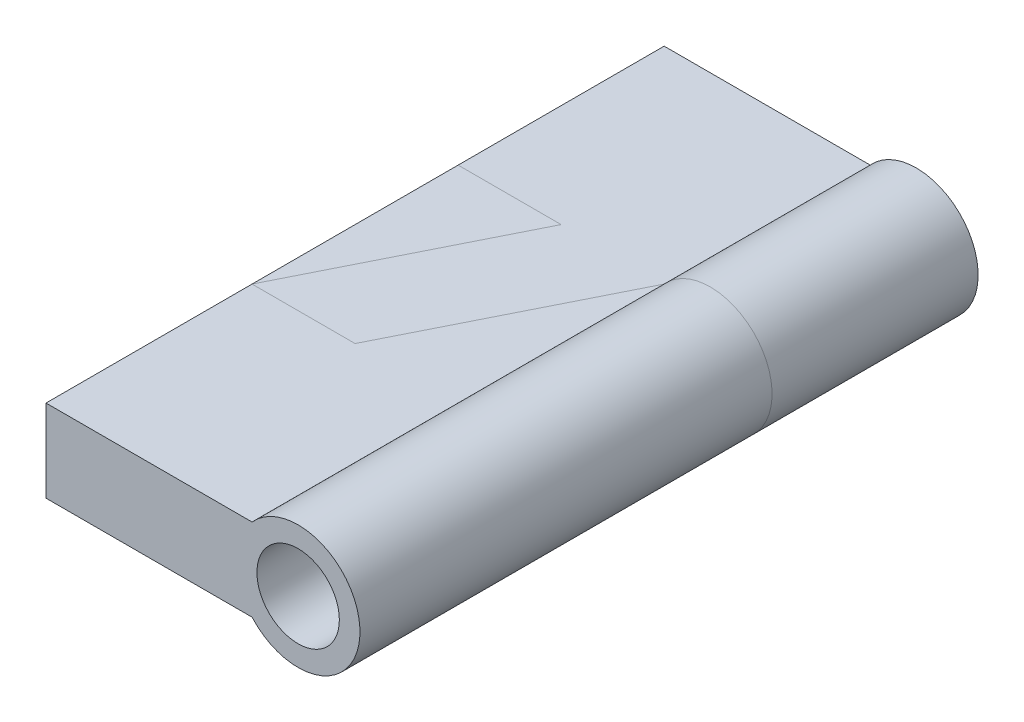
ISO-10303-21;
HEADER;
FILE_DESCRIPTION(('STEP AP214'),'2;1');
FILE_NAME('part.step','',(''),(''),'','','');
FILE_SCHEMA(('AUTOMOTIVE_DESIGN { 1 0 10303 214 1 1 1 1 }'));
ENDSEC;
DATA;
#1=APPLICATION_CONTEXT('core data for automotive mechanical design processes');
#2=APPLICATION_PROTOCOL_DEFINITION('international standard','automotive_design',2000,#1);
#3=PRODUCT_CONTEXT('',#1,'mechanical');
#4=PRODUCT('Part','Part','',(#3));
#5=PRODUCT_RELATED_PRODUCT_CATEGORY('part','',(#4));
#6=PRODUCT_DEFINITION_FORMATION('','',#4);
#7=PRODUCT_DEFINITION_CONTEXT('part definition',#1,'design');
#8=PRODUCT_DEFINITION('design','',#6,#7);
#9=PRODUCT_DEFINITION_SHAPE('','',#8);
#10=(LENGTH_UNIT() NAMED_UNIT(*) SI_UNIT(.MILLI.,.METRE.));
#11=(NAMED_UNIT(*) PLANE_ANGLE_UNIT() SI_UNIT($,.RADIAN.));
#12=(NAMED_UNIT(*) SI_UNIT($,.STERADIAN.) SOLID_ANGLE_UNIT());
#13=UNCERTAINTY_MEASURE_WITH_UNIT(LENGTH_MEASURE(1.E-05),#10,'distance_accuracy_value','');
#14=(GEOMETRIC_REPRESENTATION_CONTEXT(3) GLOBAL_UNCERTAINTY_ASSIGNED_CONTEXT((#13)) GLOBAL_UNIT_ASSIGNED_CONTEXT((#10,
#11,#12)) REPRESENTATION_CONTEXT('',''));
#15=CARTESIAN_POINT('',(0.,0.,0.));
#16=DIRECTION('',(0.,0.,1.));
#17=DIRECTION('',(1.,0.,0.));
#18=AXIS2_PLACEMENT_3D('',#15,#16,#17);
#19=CARTESIAN_POINT('',(0.,0.,5.));
#20=DIRECTION('',(0.,0.,1.));
#21=DIRECTION('',(1.,0.,0.));
#22=AXIS2_PLACEMENT_3D('',#19,#20,#21);
#23=PLANE('',#22);
#24=CARTESIAN_POINT('',(0.,0.,5.));
#25=DIRECTION('',(0.,0.,1.));
#26=DIRECTION('',(1.,0.,0.));
#27=AXIS2_PLACEMENT_3D('',#24,#25,#26);
#28=CIRCLE('',#27,1.5);
#29=CARTESIAN_POINT('',(-1.11803398874989,-1.,5.));
#30=VERTEX_POINT('',#29);
#31=CARTESIAN_POINT('',(-1.11803398874989,1.,5.));
#32=VERTEX_POINT('',#31);
#33=EDGE_CURVE('E102',#30,#32,#28,.T.);
#34=ORIENTED_EDGE('',*,*,#33,.T.);
#35=DIRECTION('',(-1.,0.,0.));
#36=VECTOR('',#35,1.);
#37=CARTESIAN_POINT('',(-6.11803398874989,1.,5.));
#38=LINE('',#37,#36);
#39=CARTESIAN_POINT('',(-6.11803398874989,1.,5.));
#40=VERTEX_POINT('',#39);
#41=EDGE_CURVE('E97',#32,#40,#38,.T.);
#42=ORIENTED_EDGE('',*,*,#41,.T.);
#43=DIRECTION('',(0.,-1.,0.));
#44=VECTOR('',#43,1.);
#45=CARTESIAN_POINT('',(-6.11803398874989,1.,5.));
#46=LINE('',#45,#44);
#47=CARTESIAN_POINT('',(-6.11803398874989,-1.,5.));
#48=VERTEX_POINT('',#47);
#49=EDGE_CURVE('E100',#40,#48,#46,.T.);
#50=ORIENTED_EDGE('',*,*,#49,.T.);
#51=DIRECTION('',(1.,0.,0.));
#52=VECTOR('',#51,1.);
#53=CARTESIAN_POINT('',(-6.11803398874989,-1.,5.));
#54=LINE('',#53,#52);
#55=EDGE_CURVE('E67',#48,#30,#54,.T.);
#56=ORIENTED_EDGE('',*,*,#55,.T.);
#57=EDGE_LOOP('',(#34,#42,#50,#56));
#58=FACE_BOUND('',#57,.T.);
#59=CARTESIAN_POINT('',(0.,0.,5.));
#60=DIRECTION('',(0.,0.,1.));
#61=DIRECTION('',(1.,0.,0.));
#62=AXIS2_PLACEMENT_3D('',#59,#60,#61);
#63=CIRCLE('',#62,1.);
#64=CARTESIAN_POINT('',(1.,0.,5.));
#65=VERTEX_POINT('',#64);
#66=EDGE_CURVE('E117',#65,#65,#63,.T.);
#67=ORIENTED_EDGE('',*,*,#66,.F.);
#68=EDGE_LOOP('',(#67));
#69=FACE_BOUND('',#68,.T.);
#70=ADVANCED_FACE('F50',(#58,#69),#23,.T.);
#71=CARTESIAN_POINT('',(0.,0.,-5.));
#72=DIRECTION('',(0.,0.,1.));
#73=DIRECTION('',(1.,0.,0.));
#74=AXIS2_PLACEMENT_3D('',#71,#72,#73);
#75=PLANE('',#74);
#76=CARTESIAN_POINT('',(0.,0.,-5.));
#77=DIRECTION('',(0.,0.,1.));
#78=DIRECTION('',(1.,0.,0.));
#79=AXIS2_PLACEMENT_3D('',#76,#77,#78);
#80=CIRCLE('',#79,1.5);
#81=CARTESIAN_POINT('',(-1.11803398874989,-1.,-5.));
#82=VERTEX_POINT('',#81);
#83=CARTESIAN_POINT('',(-1.11803398874989,1.,-5.));
#84=VERTEX_POINT('',#83);
#85=EDGE_CURVE('E114',#82,#84,#80,.T.);
#86=ORIENTED_EDGE('',*,*,#85,.F.);
#87=DIRECTION('',(1.,0.,0.));
#88=VECTOR('',#87,1.);
#89=CARTESIAN_POINT('',(-6.11803398874989,-1.,-5.));
#90=LINE('',#89,#88);
#91=CARTESIAN_POINT('',(-6.11803398874989,-1.,-5.));
#92=VERTEX_POINT('',#91);
#93=EDGE_CURVE('E90',#92,#82,#90,.T.);
#94=ORIENTED_EDGE('',*,*,#93,.F.);
#95=DIRECTION('',(0.,-1.,0.));
#96=VECTOR('',#95,1.);
#97=CARTESIAN_POINT('',(-6.11803398874989,1.,-5.));
#98=LINE('',#97,#96);
#99=CARTESIAN_POINT('',(-6.11803398874989,1.,-5.));
#100=VERTEX_POINT('',#99);
#101=EDGE_CURVE('E84',#100,#92,#98,.T.);
#102=ORIENTED_EDGE('',*,*,#101,.F.);
#103=DIRECTION('',(-1.,0.,0.));
#104=VECTOR('',#103,1.);
#105=CARTESIAN_POINT('',(-6.11803398874989,1.,-5.));
#106=LINE('',#105,#104);
#107=EDGE_CURVE('E106',#84,#100,#106,.T.);
#108=ORIENTED_EDGE('',*,*,#107,.F.);
#109=EDGE_LOOP('',(#86,#94,#102,#108));
#110=FACE_BOUND('',#109,.T.);
#111=CARTESIAN_POINT('',(0.,0.,-5.));
#112=DIRECTION('',(0.,0.,1.));
#113=DIRECTION('',(1.,0.,0.));
#114=AXIS2_PLACEMENT_3D('',#111,#112,#113);
#115=CIRCLE('',#114,1.);
#116=CARTESIAN_POINT('',(1.,0.,-5.));
#117=VERTEX_POINT('',#116);
#118=EDGE_CURVE('E129',#117,#117,#115,.T.);
#119=ORIENTED_EDGE('',*,*,#118,.T.);
#120=EDGE_LOOP('',(#119));
#121=FACE_BOUND('',#120,.T.);
#122=ADVANCED_FACE('F125',(#110,#121),#75,.F.);
#123=CARTESIAN_POINT('',(0.,0.,5.));
#124=DIRECTION('',(0.,0.,-1.));
#125=DIRECTION('',(-1.,0.,0.));
#126=AXIS2_PLACEMENT_3D('',#123,#124,#125);
#127=CYLINDRICAL_SURFACE('',#126,1.5);
#128=ORIENTED_EDGE('',*,*,#85,.T.);
#129=DIRECTION('',(0.,0.,-1.));
#130=VECTOR('',#129,1.);
#131=CARTESIAN_POINT('',(-1.11803398874989,1.,5.));
#132=LINE('',#131,#130);
#133=EDGE_CURVE('E12',#32,#84,#132,.T.);
#134=ORIENTED_EDGE('',*,*,#133,.F.);
#135=ORIENTED_EDGE('',*,*,#33,.F.);
#136=DIRECTION('',(0.,0.,-1.));
#137=VECTOR('',#136,1.);
#138=CARTESIAN_POINT('',(-1.11803398874989,-1.,5.));
#139=LINE('',#138,#137);
#140=EDGE_CURVE('E110',#30,#82,#139,.T.);
#141=ORIENTED_EDGE('',*,*,#140,.T.);
#142=EDGE_LOOP('',(#128,#134,#135,#141));
#143=FACE_BOUND('',#142,.T.);
#144=ADVANCED_FACE('F52',(#143),#127,.T.);
#145=CARTESIAN_POINT('',(-6.11803398874989,1.,5.));
#146=DIRECTION('',(0.,-1.,0.));
#147=DIRECTION('',(0.,0.,-1.));
#148=AXIS2_PLACEMENT_3D('',#145,#146,#147);
#149=PLANE('',#148);
#150=ORIENTED_EDGE('',*,*,#107,.T.);
#151=DIRECTION('',(0.,0.,-1.));
#152=VECTOR('',#151,1.);
#153=CARTESIAN_POINT('',(-6.11803398874989,1.,5.));
#154=LINE('',#153,#152);
#155=EDGE_CURVE('E59',#40,#100,#154,.T.);
#156=ORIENTED_EDGE('',*,*,#155,.F.);
#157=ORIENTED_EDGE('',*,*,#41,.F.);
#158=ORIENTED_EDGE('',*,*,#133,.T.);
#159=EDGE_LOOP('',(#150,#156,#157,#158));
#160=FACE_BOUND('',#159,.T.);
#161=ADVANCED_FACE('F105',(#160),#149,.F.);
#162=CARTESIAN_POINT('',(-6.11803398874989,1.,5.));
#163=DIRECTION('',(1.,0.,0.));
#164=DIRECTION('',(0.,0.,-1.));
#165=AXIS2_PLACEMENT_3D('',#162,#163,#164);
#166=PLANE('',#165);
#167=ORIENTED_EDGE('',*,*,#101,.T.);
#168=DIRECTION('',(0.,0.,-1.));
#169=VECTOR('',#168,1.);
#170=CARTESIAN_POINT('',(-6.11803398874989,-1.,5.));
#171=LINE('',#170,#169);
#172=EDGE_CURVE('E107',#48,#92,#171,.T.);
#173=ORIENTED_EDGE('',*,*,#172,.F.);
#174=ORIENTED_EDGE('',*,*,#49,.F.);
#175=ORIENTED_EDGE('',*,*,#155,.T.);
#176=EDGE_LOOP('',(#167,#173,#174,#175));
#177=FACE_BOUND('',#176,.T.);
#178=ADVANCED_FACE('F108',(#177),#166,.F.);
#179=CARTESIAN_POINT('',(-6.11803398874989,-1.,5.));
#180=DIRECTION('',(0.,1.,0.));
#181=DIRECTION('',(0.,0.,1.));
#182=AXIS2_PLACEMENT_3D('',#179,#180,#181);
#183=PLANE('',#182);
#184=ORIENTED_EDGE('',*,*,#93,.T.);
#185=ORIENTED_EDGE('',*,*,#140,.F.);
#186=ORIENTED_EDGE('',*,*,#55,.F.);
#187=ORIENTED_EDGE('',*,*,#172,.T.);
#188=EDGE_LOOP('',(#184,#185,#186,#187));
#189=FACE_BOUND('',#188,.T.);
#190=ADVANCED_FACE('F122',(#189),#183,.F.);
#191=CARTESIAN_POINT('',(0.,0.,5.));
#192=DIRECTION('',(0.,0.,-1.));
#193=DIRECTION('',(-1.,0.,0.));
#194=AXIS2_PLACEMENT_3D('',#191,#192,#193);
#195=CYLINDRICAL_SURFACE('',#194,1.);
#196=ORIENTED_EDGE('',*,*,#66,.T.);
#197=EDGE_LOOP('',(#196));
#198=FACE_BOUND('',#197,.T.);
#199=ORIENTED_EDGE('',*,*,#118,.F.);
#200=EDGE_LOOP('',(#199));
#201=FACE_BOUND('',#200,.T.);
#202=ADVANCED_FACE('F135',(#198,#201),#195,.F.);
#203=CLOSED_SHELL('',(#70,#122,#144,#161,#178,#190,#202));
#204=MANIFOLD_SOLID_BREP('B2',#203);
#205=CARTESIAN_POINT('',(0.,0.,10.));
#206=DIRECTION('',(0.,0.,1.));
#207=DIRECTION('',(1.,0.,0.));
#208=AXIS2_PLACEMENT_3D('',#205,#206,#207);
#209=PLANE('',#208);
#210=CARTESIAN_POINT('',(0.,0.,10.));
#211=DIRECTION('',(0.,0.,1.));
#212=DIRECTION('',(1.,0.,0.));
#213=AXIS2_PLACEMENT_3D('',#210,#211,#212);
#214=CIRCLE('',#213,1.5);
#215=CARTESIAN_POINT('',(-1.11803398874989,-1.,10.));
#216=VERTEX_POINT('',#215);
#217=CARTESIAN_POINT('',(-1.11803398874989,1.,10.));
#218=VERTEX_POINT('',#217);
#219=EDGE_CURVE('E272',#216,#218,#214,.T.);
#220=ORIENTED_EDGE('',*,*,#219,.T.);
#221=DIRECTION('',(-1.,0.,0.));
#222=VECTOR('',#221,1.);
#223=CARTESIAN_POINT('',(-6.11803398874989,1.,10.));
#224=LINE('',#223,#222);
#225=CARTESIAN_POINT('',(-6.11803398874989,1.,10.));
#226=VERTEX_POINT('',#225);
#227=EDGE_CURVE('E267',#218,#226,#224,.T.);
#228=ORIENTED_EDGE('',*,*,#227,.T.);
#229=DIRECTION('',(0.,-1.,0.));
#230=VECTOR('',#229,1.);
#231=CARTESIAN_POINT('',(-6.11803398874989,1.,10.));
#232=LINE('',#231,#230);
#233=CARTESIAN_POINT('',(-6.11803398874989,-1.,10.));
#234=VERTEX_POINT('',#233);
#235=EDGE_CURVE('E270',#226,#234,#232,.T.);
#236=ORIENTED_EDGE('',*,*,#235,.T.);
#237=DIRECTION('',(1.,0.,0.));
#238=VECTOR('',#237,1.);
#239=CARTESIAN_POINT('',(-6.11803398874989,-1.,10.));
#240=LINE('',#239,#238);
#241=EDGE_CURVE('E237',#234,#216,#240,.T.);
#242=ORIENTED_EDGE('',*,*,#241,.T.);
#243=EDGE_LOOP('',(#220,#228,#236,#242));
#244=FACE_BOUND('',#243,.T.);
#245=CARTESIAN_POINT('',(0.,0.,10.));
#246=DIRECTION('',(0.,0.,1.));
#247=DIRECTION('',(1.,0.,0.));
#248=AXIS2_PLACEMENT_3D('',#245,#246,#247);
#249=CIRCLE('',#248,1.);
#250=CARTESIAN_POINT('',(1.,0.,10.));
#251=VERTEX_POINT('',#250);
#252=EDGE_CURVE('E287',#251,#251,#249,.T.);
#253=ORIENTED_EDGE('',*,*,#252,.F.);
#254=EDGE_LOOP('',(#253));
#255=FACE_BOUND('',#254,.T.);
#256=ADVANCED_FACE('F220',(#244,#255),#209,.T.);
#257=CARTESIAN_POINT('',(0.,0.,0.));
#258=DIRECTION('',(0.,0.,1.));
#259=DIRECTION('',(1.,0.,0.));
#260=AXIS2_PLACEMENT_3D('',#257,#258,#259);
#261=PLANE('',#260);
#262=CARTESIAN_POINT('',(0.,0.,0.));
#263=DIRECTION('',(0.,0.,1.));
#264=DIRECTION('',(1.,0.,0.));
#265=AXIS2_PLACEMENT_3D('',#262,#263,#264);
#266=CIRCLE('',#265,1.5);
#267=CARTESIAN_POINT('',(-1.11803398874989,-1.,0.));
#268=VERTEX_POINT('',#267);
#269=CARTESIAN_POINT('',(-1.11803398874989,1.,0.));
#270=VERTEX_POINT('',#269);
#271=EDGE_CURVE('E284',#268,#270,#266,.T.);
#272=ORIENTED_EDGE('',*,*,#271,.F.);
#273=DIRECTION('',(1.,0.,0.));
#274=VECTOR('',#273,1.);
#275=CARTESIAN_POINT('',(-6.11803398874989,-1.,0.));
#276=LINE('',#275,#274);
#277=CARTESIAN_POINT('',(-6.11803398874989,-1.,0.));
#278=VERTEX_POINT('',#277);
#279=EDGE_CURVE('E260',#278,#268,#276,.T.);
#280=ORIENTED_EDGE('',*,*,#279,.F.);
#281=DIRECTION('',(0.,-1.,0.));
#282=VECTOR('',#281,1.);
#283=CARTESIAN_POINT('',(-6.11803398874989,1.,0.));
#284=LINE('',#283,#282);
#285=CARTESIAN_POINT('',(-6.11803398874989,1.,0.));
#286=VERTEX_POINT('',#285);
#287=EDGE_CURVE('E254',#286,#278,#284,.T.);
#288=ORIENTED_EDGE('',*,*,#287,.F.);
#289=DIRECTION('',(-1.,0.,0.));
#290=VECTOR('',#289,1.);
#291=CARTESIAN_POINT('',(-6.11803398874989,1.,0.));
#292=LINE('',#291,#290);
#293=EDGE_CURVE('E276',#270,#286,#292,.T.);
#294=ORIENTED_EDGE('',*,*,#293,.F.);
#295=EDGE_LOOP('',(#272,#280,#288,#294));
#296=FACE_BOUND('',#295,.T.);
#297=CARTESIAN_POINT('',(0.,0.,0.));
#298=DIRECTION('',(0.,0.,1.));
#299=DIRECTION('',(1.,0.,0.));
#300=AXIS2_PLACEMENT_3D('',#297,#298,#299);
#301=CIRCLE('',#300,1.);
#302=CARTESIAN_POINT('',(1.,0.,0.));
#303=VERTEX_POINT('',#302);
#304=EDGE_CURVE('E299',#303,#303,#301,.T.);
#305=ORIENTED_EDGE('',*,*,#304,.T.);
#306=EDGE_LOOP('',(#305));
#307=FACE_BOUND('',#306,.T.);
#308=ADVANCED_FACE('F295',(#296,#307),#261,.F.);
#309=CARTESIAN_POINT('',(0.,0.,10.));
#310=DIRECTION('',(0.,0.,-1.));
#311=DIRECTION('',(-1.,0.,0.));
#312=AXIS2_PLACEMENT_3D('',#309,#310,#311);
#313=CYLINDRICAL_SURFACE('',#312,1.5);
#314=ORIENTED_EDGE('',*,*,#271,.T.);
#315=DIRECTION('',(0.,0.,-1.));
#316=VECTOR('',#315,1.);
#317=CARTESIAN_POINT('',(-1.11803398874989,1.,10.));
#318=LINE('',#317,#316);
#319=EDGE_CURVE('E48',#218,#270,#318,.T.);
#320=ORIENTED_EDGE('',*,*,#319,.F.);
#321=ORIENTED_EDGE('',*,*,#219,.F.);
#322=DIRECTION('',(0.,0.,-1.));
#323=VECTOR('',#322,1.);
#324=CARTESIAN_POINT('',(-1.11803398874989,-1.,10.));
#325=LINE('',#324,#323);
#326=EDGE_CURVE('E280',#216,#268,#325,.T.);
#327=ORIENTED_EDGE('',*,*,#326,.T.);
#328=EDGE_LOOP('',(#314,#320,#321,#327));
#329=FACE_BOUND('',#328,.T.);
#330=ADVANCED_FACE('F222',(#329),#313,.T.);
#331=CARTESIAN_POINT('',(-6.11803398874989,1.,10.));
#332=DIRECTION('',(0.,-1.,0.));
#333=DIRECTION('',(0.,0.,-1.));
#334=AXIS2_PLACEMENT_3D('',#331,#332,#333);
#335=PLANE('',#334);
#336=ORIENTED_EDGE('',*,*,#293,.T.);
#337=DIRECTION('',(0.,0.,-1.));
#338=VECTOR('',#337,1.);
#339=CARTESIAN_POINT('',(-6.11803398874989,1.,10.));
#340=LINE('',#339,#338);
#341=EDGE_CURVE('E229',#226,#286,#340,.T.);
#342=ORIENTED_EDGE('',*,*,#341,.F.);
#343=ORIENTED_EDGE('',*,*,#227,.F.);
#344=ORIENTED_EDGE('',*,*,#319,.T.);
#345=EDGE_LOOP('',(#336,#342,#343,#344));
#346=FACE_BOUND('',#345,.T.);
#347=ADVANCED_FACE('F275',(#346),#335,.F.);
#348=CARTESIAN_POINT('',(-6.11803398874989,1.,10.));
#349=DIRECTION('',(1.,0.,0.));
#350=DIRECTION('',(0.,0.,-1.));
#351=AXIS2_PLACEMENT_3D('',#348,#349,#350);
#352=PLANE('',#351);
#353=ORIENTED_EDGE('',*,*,#287,.T.);
#354=DIRECTION('',(0.,0.,-1.));
#355=VECTOR('',#354,1.);
#356=CARTESIAN_POINT('',(-6.11803398874989,-1.,10.));
#357=LINE('',#356,#355);
#358=EDGE_CURVE('E277',#234,#278,#357,.T.);
#359=ORIENTED_EDGE('',*,*,#358,.F.);
#360=ORIENTED_EDGE('',*,*,#235,.F.);
#361=ORIENTED_EDGE('',*,*,#341,.T.);
#362=EDGE_LOOP('',(#353,#359,#360,#361));
#363=FACE_BOUND('',#362,.T.);
#364=ADVANCED_FACE('F278',(#363),#352,.F.);
#365=CARTESIAN_POINT('',(-6.11803398874989,-1.,10.));
#366=DIRECTION('',(0.,1.,0.));
#367=DIRECTION('',(0.,0.,1.));
#368=AXIS2_PLACEMENT_3D('',#365,#366,#367);
#369=PLANE('',#368);
#370=ORIENTED_EDGE('',*,*,#279,.T.);
#371=ORIENTED_EDGE('',*,*,#326,.F.);
#372=ORIENTED_EDGE('',*,*,#241,.F.);
#373=ORIENTED_EDGE('',*,*,#358,.T.);
#374=EDGE_LOOP('',(#370,#371,#372,#373));
#375=FACE_BOUND('',#374,.T.);
#376=ADVANCED_FACE('F292',(#375),#369,.F.);
#377=CARTESIAN_POINT('',(0.,0.,10.));
#378=DIRECTION('',(0.,0.,-1.));
#379=DIRECTION('',(-1.,0.,0.));
#380=AXIS2_PLACEMENT_3D('',#377,#378,#379);
#381=CYLINDRICAL_SURFACE('',#380,1.);
#382=ORIENTED_EDGE('',*,*,#252,.T.);
#383=EDGE_LOOP('',(#382));
#384=FACE_BOUND('',#383,.T.);
#385=ORIENTED_EDGE('',*,*,#304,.F.);
#386=EDGE_LOOP('',(#385));
#387=FACE_BOUND('',#386,.T.);
#388=ADVANCED_FACE('F305',(#384,#387),#381,.F.);
#389=CLOSED_SHELL('',(#256,#308,#330,#347,#364,#376,#388));
#390=MANIFOLD_SOLID_BREP('B6_NOT_SHOWN',#389);
#391=ADVANCED_BREP_SHAPE_REPRESENTATION('',(#18,#204,#390),#14);
#392=SHAPE_DEFINITION_REPRESENTATION(#9,#391);
ENDSEC;
END-ISO-10303-21;
